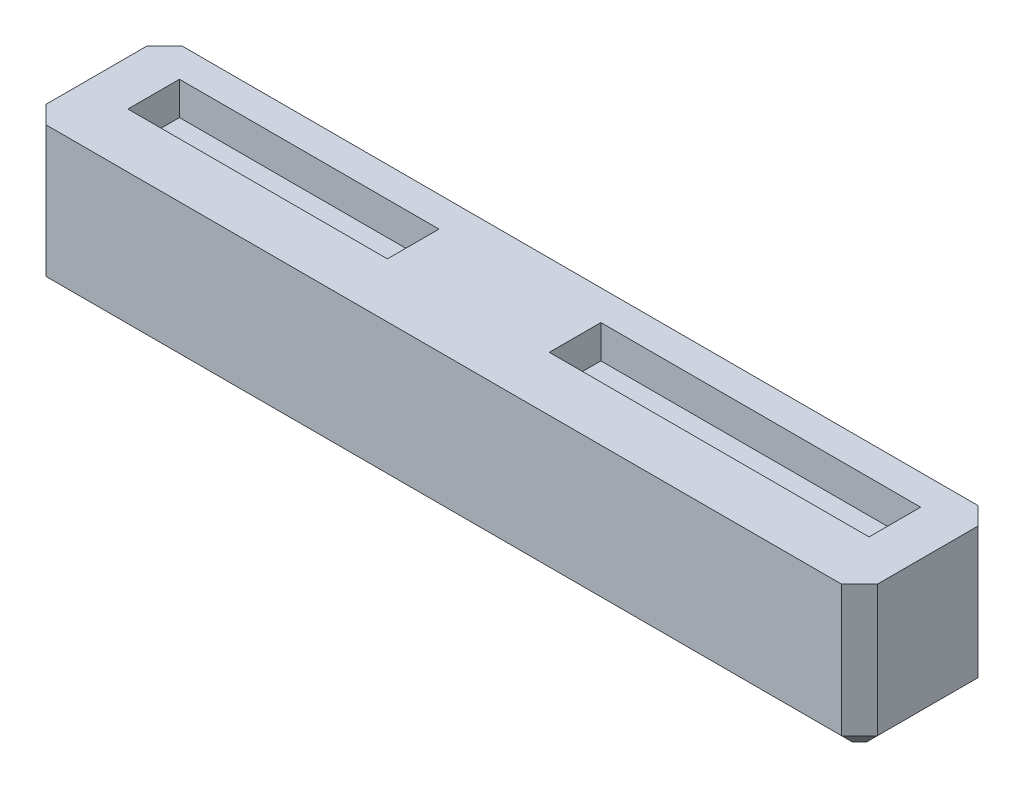
ISO-10303-21;
HEADER;
FILE_DESCRIPTION(('STEP AP214'),'2;1');
FILE_NAME('part.step','',(''),(''),'','','');
FILE_SCHEMA(('AUTOMOTIVE_DESIGN { 1 0 10303 214 1 1 1 1 }'));
ENDSEC;
DATA;
#1=APPLICATION_CONTEXT('core data for automotive mechanical design processes');
#2=APPLICATION_PROTOCOL_DEFINITION('international standard','automotive_design',2000,#1);
#3=PRODUCT_CONTEXT('',#1,'mechanical');
#4=PRODUCT('Part','Part','',(#3));
#5=PRODUCT_RELATED_PRODUCT_CATEGORY('part','',(#4));
#6=PRODUCT_DEFINITION_FORMATION('','',#4);
#7=PRODUCT_DEFINITION_CONTEXT('part definition',#1,'design');
#8=PRODUCT_DEFINITION('design','',#6,#7);
#9=PRODUCT_DEFINITION_SHAPE('','',#8);
#10=(LENGTH_UNIT() NAMED_UNIT(*) SI_UNIT(.MILLI.,.METRE.));
#11=(NAMED_UNIT(*) PLANE_ANGLE_UNIT() SI_UNIT($,.RADIAN.));
#12=(NAMED_UNIT(*) SI_UNIT($,.STERADIAN.) SOLID_ANGLE_UNIT());
#13=UNCERTAINTY_MEASURE_WITH_UNIT(LENGTH_MEASURE(1.E-05),#10,'distance_accuracy_value','');
#14=(GEOMETRIC_REPRESENTATION_CONTEXT(3) GLOBAL_UNCERTAINTY_ASSIGNED_CONTEXT((#13)) GLOBAL_UNIT_ASSIGNED_CONTEXT((#10,
#11,#12)) REPRESENTATION_CONTEXT('',''));
#15=CARTESIAN_POINT('',(0.,0.,0.));
#16=DIRECTION('',(0.,0.,1.));
#17=DIRECTION('',(1.,0.,0.));
#18=AXIS2_PLACEMENT_3D('',#15,#16,#17);
#19=CARTESIAN_POINT('',(142.669,-225.777307234154,-0.1));
#20=DIRECTION('',(-1.,0.,0.));
#21=DIRECTION('',(0.,0.,1.));
#22=AXIS2_PLACEMENT_3D('',#19,#20,#21);
#23=PLANE('',#22);
#24=DIRECTION('',(0.,1.,0.));
#25=VECTOR('',#24,1.);
#26=CARTESIAN_POINT('',(142.669,-225.777307234154,3.89));
#27=LINE('',#26,#25);
#28=CARTESIAN_POINT('',(142.669,-146.0008,3.89));
#29=VERTEX_POINT('',#28);
#30=CARTESIAN_POINT('',(142.669,-134.7208,3.89));
#31=VERTEX_POINT('',#30);
#32=EDGE_CURVE('E217',#29,#31,#27,.T.);
#33=ORIENTED_EDGE('',*,*,#32,.T.);
#34=DIRECTION('',(0.,0.,1.));
#35=VECTOR('',#34,1.);
#36=CARTESIAN_POINT('',(142.669,-134.7208,-0.1));
#37=LINE('',#36,#35);
#38=CARTESIAN_POINT('',(142.669,-134.7208,-0.459999999999995));
#39=VERTEX_POINT('',#38);
#40=EDGE_CURVE('E213',#39,#31,#37,.T.);
#41=ORIENTED_EDGE('',*,*,#40,.F.);
#42=DIRECTION('',(0.,1.,0.));
#43=VECTOR('',#42,1.);
#44=CARTESIAN_POINT('',(142.669,-164.554305137144,-0.459999999999995));
#45=LINE('',#44,#43);
#46=CARTESIAN_POINT('',(142.669,-137.5208,-0.459999999999995));
#47=VERTEX_POINT('',#46);
#48=EDGE_CURVE('E215',#47,#39,#45,.T.);
#49=ORIENTED_EDGE('',*,*,#48,.F.);
#50=DIRECTION('',(0.,0.,1.));
#51=VECTOR('',#50,1.);
#52=CARTESIAN_POINT('',(142.669,-137.5208,1.24));
#53=LINE('',#52,#51);
#54=CARTESIAN_POINT('',(142.669,-137.5208,1.24000000000001));
#55=VERTEX_POINT('',#54);
#56=EDGE_CURVE('E244',#47,#55,#53,.T.);
#57=ORIENTED_EDGE('',*,*,#56,.T.);
#58=DIRECTION('',(0.,-1.,0.));
#59=VECTOR('',#58,1.);
#60=CARTESIAN_POINT('',(142.669,-110.307543994846,1.24));
#61=LINE('',#60,#59);
#62=CARTESIAN_POINT('',(142.669,-146.0008,1.24));
#63=VERTEX_POINT('',#62);
#64=EDGE_CURVE('E266',#55,#63,#61,.T.);
#65=ORIENTED_EDGE('',*,*,#64,.T.);
#66=DIRECTION('',(0.,0.,-1.));
#67=VECTOR('',#66,1.);
#68=CARTESIAN_POINT('',(142.669,-146.0008,-0.1));
#69=LINE('',#68,#67);
#70=EDGE_CURVE('E381',#29,#63,#69,.T.);
#71=ORIENTED_EDGE('',*,*,#70,.F.);
#72=EDGE_LOOP('',(#33,#41,#49,#57,#65,#71));
#73=FACE_BOUND('',#72,.T.);
#74=ADVANCED_FACE('F45',(#73),#23,.T.);
#75=CARTESIAN_POINT('',(120.769,-225.777307234154,-0.100000000000003));
#76=DIRECTION('',(1.,0.,0.));
#77=DIRECTION('',(0.,0.,-1.));
#78=AXIS2_PLACEMENT_3D('',#75,#76,#77);
#79=PLANE('',#78);
#80=DIRECTION('',(0.,-1.,0.));
#81=VECTOR('',#80,1.);
#82=CARTESIAN_POINT('',(120.769,-110.307543994846,1.24000000000001));
#83=LINE('',#82,#81);
#84=CARTESIAN_POINT('',(120.769,-137.5208,1.24000000000001));
#85=VERTEX_POINT('',#84);
#86=CARTESIAN_POINT('',(120.769,-146.0008,1.24000000000001));
#87=VERTEX_POINT('',#86);
#88=EDGE_CURVE('E261',#85,#87,#83,.T.);
#89=ORIENTED_EDGE('',*,*,#88,.F.);
#90=DIRECTION('',(0.,0.,-1.));
#91=VECTOR('',#90,1.);
#92=CARTESIAN_POINT('',(120.769,-137.5208,1.24000000000001));
#93=LINE('',#92,#91);
#94=CARTESIAN_POINT('',(120.769,-137.5208,-0.459999999999995));
#95=VERTEX_POINT('',#94);
#96=EDGE_CURVE('E262',#85,#95,#93,.T.);
#97=ORIENTED_EDGE('',*,*,#96,.T.);
#98=DIRECTION('',(0.,1.,0.));
#99=VECTOR('',#98,1.);
#100=CARTESIAN_POINT('',(120.769,-164.554305137144,-0.459999999999995));
#101=LINE('',#100,#99);
#102=CARTESIAN_POINT('',(120.769,-134.7208,-0.459999999999995));
#103=VERTEX_POINT('',#102);
#104=EDGE_CURVE('E242',#95,#103,#101,.T.);
#105=ORIENTED_EDGE('',*,*,#104,.T.);
#106=DIRECTION('',(0.,0.,-1.));
#107=VECTOR('',#106,1.);
#108=CARTESIAN_POINT('',(120.769,-134.7208,-0.100000000000003));
#109=LINE('',#108,#107);
#110=CARTESIAN_POINT('',(120.769,-134.7208,3.89));
#111=VERTEX_POINT('',#110);
#112=EDGE_CURVE('E64',#111,#103,#109,.T.);
#113=ORIENTED_EDGE('',*,*,#112,.F.);
#114=DIRECTION('',(0.,1.,0.));
#115=VECTOR('',#114,1.);
#116=CARTESIAN_POINT('',(120.769,-225.777307234154,3.89));
#117=LINE('',#116,#115);
#118=CARTESIAN_POINT('',(120.769,-146.0008,3.89));
#119=VERTEX_POINT('',#118);
#120=EDGE_CURVE('E378',#119,#111,#117,.T.);
#121=ORIENTED_EDGE('',*,*,#120,.F.);
#122=DIRECTION('',(0.,0.,1.));
#123=VECTOR('',#122,1.);
#124=CARTESIAN_POINT('',(120.769,-146.0008,-0.100000000000003));
#125=LINE('',#124,#123);
#126=EDGE_CURVE('E396',#87,#119,#125,.T.);
#127=ORIENTED_EDGE('',*,*,#126,.F.);
#128=EDGE_LOOP('',(#89,#97,#105,#113,#121,#127));
#129=FACE_BOUND('',#128,.T.);
#130=ADVANCED_FACE('F549',(#129),#79,.T.);
#131=CARTESIAN_POINT('',(0.,-146.0008,0.));
#132=DIRECTION('',(0.,-1.,0.));
#133=DIRECTION('',(0.,0.,-1.));
#134=AXIS2_PLACEMENT_3D('',#131,#132,#133);
#135=PLANE('',#134);
#136=DIRECTION('',(1.,0.,0.));
#137=VECTOR('',#136,1.);
#138=CARTESIAN_POINT('',(142.669,-146.0008,1.24));
#139=LINE('',#138,#137);
#140=EDGE_CURVE('E270',#87,#63,#139,.T.);
#141=ORIENTED_EDGE('',*,*,#140,.F.);
#142=ORIENTED_EDGE('',*,*,#126,.T.);
#143=DIRECTION('',(1.,0.,0.));
#144=VECTOR('',#143,1.);
#145=CARTESIAN_POINT('',(142.669,-146.0008,3.89));
#146=LINE('',#145,#144);
#147=EDGE_CURVE('E386',#119,#29,#146,.T.);
#148=ORIENTED_EDGE('',*,*,#147,.T.);
#149=ORIENTED_EDGE('',*,*,#70,.T.);
#150=EDGE_LOOP('',(#141,#142,#148,#149));
#151=FACE_BOUND('',#150,.T.);
#152=ADVANCED_FACE('F554',(#151),#135,.F.);
#153=CARTESIAN_POINT('',(183.309,-225.777307234154,-0.099999999999995));
#154=DIRECTION('',(-1.,0.,0.));
#155=DIRECTION('',(0.,0.,1.));
#156=AXIS2_PLACEMENT_3D('',#153,#154,#155);
#157=PLANE('',#156);
#158=DIRECTION('',(0.,1.,0.));
#159=VECTOR('',#158,1.);
#160=CARTESIAN_POINT('',(183.309,-225.777307234154,3.89));
#161=LINE('',#160,#159);
#162=CARTESIAN_POINT('',(183.309,-146.0008,3.89));
#163=VERTEX_POINT('',#162);
#164=CARTESIAN_POINT('',(183.309,-134.7208,3.89));
#165=VERTEX_POINT('',#164);
#166=EDGE_CURVE('E305',#163,#165,#161,.T.);
#167=ORIENTED_EDGE('',*,*,#166,.T.);
#168=DIRECTION('',(0.,0.,1.));
#169=VECTOR('',#168,1.);
#170=CARTESIAN_POINT('',(183.309,-134.7208,-0.099999999999995));
#171=LINE('',#170,#169);
#172=CARTESIAN_POINT('',(183.309,-134.7208,-0.459999999999998));
#173=VERTEX_POINT('',#172);
#174=EDGE_CURVE('E347',#173,#165,#171,.T.);
#175=ORIENTED_EDGE('',*,*,#174,.F.);
#176=DIRECTION('',(0.,1.,0.));
#177=VECTOR('',#176,1.);
#178=CARTESIAN_POINT('',(183.309,-164.554305137144,-0.459999999999998));
#179=LINE('',#178,#177);
#180=CARTESIAN_POINT('',(183.309,-137.5208,-0.459999999999998));
#181=VERTEX_POINT('',#180);
#182=EDGE_CURVE('E237',#181,#173,#179,.T.);
#183=ORIENTED_EDGE('',*,*,#182,.F.);
#184=DIRECTION('',(0.,0.,1.));
#185=VECTOR('',#184,1.);
#186=CARTESIAN_POINT('',(183.309,-137.5208,1.24));
#187=LINE('',#186,#185);
#188=CARTESIAN_POINT('',(183.309,-137.5208,1.24));
#189=VERTEX_POINT('',#188);
#190=EDGE_CURVE('E282',#181,#189,#187,.T.);
#191=ORIENTED_EDGE('',*,*,#190,.T.);
#192=DIRECTION('',(0.,-1.,0.));
#193=VECTOR('',#192,1.);
#194=CARTESIAN_POINT('',(183.309,-110.307543994846,1.24));
#195=LINE('',#194,#193);
#196=CARTESIAN_POINT('',(183.309,-146.0008,1.24));
#197=VERTEX_POINT('',#196);
#198=EDGE_CURVE('E290',#189,#197,#195,.T.);
#199=ORIENTED_EDGE('',*,*,#198,.T.);
#200=DIRECTION('',(0.,0.,-1.));
#201=VECTOR('',#200,1.);
#202=CARTESIAN_POINT('',(183.309,-146.0008,-0.099999999999995));
#203=LINE('',#202,#201);
#204=EDGE_CURVE('E382',#163,#197,#203,.T.);
#205=ORIENTED_EDGE('',*,*,#204,.F.);
#206=EDGE_LOOP('',(#167,#175,#183,#191,#199,#205));
#207=FACE_BOUND('',#206,.T.);
#208=ADVANCED_FACE('F615',(#207),#157,.T.);
#209=CARTESIAN_POINT('',(156.329,-225.777307234154,-0.0999999999999983));
#210=DIRECTION('',(1.,0.,0.));
#211=DIRECTION('',(0.,0.,-1.));
#212=AXIS2_PLACEMENT_3D('',#209,#210,#211);
#213=PLANE('',#212);
#214=DIRECTION('',(0.,-1.,0.));
#215=VECTOR('',#214,1.);
#216=CARTESIAN_POINT('',(156.329,-110.307543994846,1.24));
#217=LINE('',#216,#215);
#218=CARTESIAN_POINT('',(156.329,-137.5208,1.24));
#219=VERTEX_POINT('',#218);
#220=CARTESIAN_POINT('',(156.329,-146.0008,1.24));
#221=VERTEX_POINT('',#220);
#222=EDGE_CURVE('E294',#219,#221,#217,.T.);
#223=ORIENTED_EDGE('',*,*,#222,.F.);
#224=DIRECTION('',(0.,0.,-1.));
#225=VECTOR('',#224,1.);
#226=CARTESIAN_POINT('',(156.329,-137.5208,1.24));
#227=LINE('',#226,#225);
#228=CARTESIAN_POINT('',(156.329,-137.5208,-0.459999999999998));
#229=VERTEX_POINT('',#228);
#230=EDGE_CURVE('E279',#219,#229,#227,.T.);
#231=ORIENTED_EDGE('',*,*,#230,.T.);
#232=DIRECTION('',(0.,1.,0.));
#233=VECTOR('',#232,1.);
#234=CARTESIAN_POINT('',(156.329,-164.554305137144,-0.459999999999998));
#235=LINE('',#234,#233);
#236=CARTESIAN_POINT('',(156.329,-134.7208,-0.459999999999998));
#237=VERTEX_POINT('',#236);
#238=EDGE_CURVE('E250',#229,#237,#235,.T.);
#239=ORIENTED_EDGE('',*,*,#238,.T.);
#240=DIRECTION('',(0.,0.,-1.));
#241=VECTOR('',#240,1.);
#242=CARTESIAN_POINT('',(156.329,-134.7208,-0.0999999999999983));
#243=LINE('',#242,#241);
#244=CARTESIAN_POINT('',(156.329,-134.7208,3.89));
#245=VERTEX_POINT('',#244);
#246=EDGE_CURVE('E72',#245,#237,#243,.T.);
#247=ORIENTED_EDGE('',*,*,#246,.F.);
#248=DIRECTION('',(0.,1.,0.));
#249=VECTOR('',#248,1.);
#250=CARTESIAN_POINT('',(156.329,-225.777307234154,3.89));
#251=LINE('',#250,#249);
#252=CARTESIAN_POINT('',(156.329,-146.0008,3.89));
#253=VERTEX_POINT('',#252);
#254=EDGE_CURVE('E373',#253,#245,#251,.T.);
#255=ORIENTED_EDGE('',*,*,#254,.F.);
#256=DIRECTION('',(0.,0.,1.));
#257=VECTOR('',#256,1.);
#258=CARTESIAN_POINT('',(156.329,-146.0008,-0.0999999999999983));
#259=LINE('',#258,#257);
#260=EDGE_CURVE('E385',#221,#253,#259,.T.);
#261=ORIENTED_EDGE('',*,*,#260,.F.);
#262=EDGE_LOOP('',(#223,#231,#239,#247,#255,#261));
#263=FACE_BOUND('',#262,.T.);
#264=ADVANCED_FACE('F620',(#263),#213,.T.);
#265=DIRECTION('',(1.,0.,0.));
#266=VECTOR('',#265,1.);
#267=CARTESIAN_POINT('',(183.309,-146.0008,1.24));
#268=LINE('',#267,#266);
#269=EDGE_CURVE('E274',#221,#197,#268,.T.);
#270=ORIENTED_EDGE('',*,*,#269,.F.);
#271=ORIENTED_EDGE('',*,*,#260,.T.);
#272=DIRECTION('',(1.,0.,0.));
#273=VECTOR('',#272,1.);
#274=CARTESIAN_POINT('',(183.309,-146.0008,3.89));
#275=LINE('',#274,#273);
#276=EDGE_CURVE('E387',#253,#163,#275,.T.);
#277=ORIENTED_EDGE('',*,*,#276,.T.);
#278=ORIENTED_EDGE('',*,*,#204,.T.);
#279=EDGE_LOOP('',(#270,#271,#277,#278));
#280=FACE_BOUND('',#279,.T.);
#281=ADVANCED_FACE('F617',(#280),#135,.F.);
#282=CARTESIAN_POINT('',(0.,-134.7208,0.));
#283=DIRECTION('',(0.,-1.,0.));
#284=DIRECTION('',(0.,0.,-1.));
#285=AXIS2_PLACEMENT_3D('',#282,#283,#284);
#286=PLANE('',#285);
#287=DIRECTION('',(-1.,0.,0.));
#288=VECTOR('',#287,1.);
#289=CARTESIAN_POINT('',(156.329,-134.7208,-0.459999999999998));
#290=LINE('',#289,#288);
#291=EDGE_CURVE('E234',#173,#237,#290,.T.);
#292=ORIENTED_EDGE('',*,*,#291,.F.);
#293=ORIENTED_EDGE('',*,*,#174,.T.);
#294=DIRECTION('',(-1.,0.,0.));
#295=VECTOR('',#294,1.);
#296=CARTESIAN_POINT('',(183.309,-134.7208,3.89));
#297=LINE('',#296,#295);
#298=EDGE_CURVE('E344',#165,#245,#297,.T.);
#299=ORIENTED_EDGE('',*,*,#298,.T.);
#300=ORIENTED_EDGE('',*,*,#246,.T.);
#301=EDGE_LOOP('',(#292,#293,#299,#300));
#302=FACE_BOUND('',#301,.T.);
#303=DIRECTION('',(0.707106781186547,0.,0.707106781186547));
#304=VECTOR('',#303,1.);
#305=CARTESIAN_POINT('',(185.609,-134.7208,-3.));
#306=LINE('',#305,#304);
#307=CARTESIAN_POINT('',(185.609,-134.7208,-3.));
#308=VERTEX_POINT('',#307);
#309=CARTESIAN_POINT('',(187.109,-134.7208,-1.5));
#310=VERTEX_POINT('',#309);
#311=EDGE_CURVE('E337',#308,#310,#306,.T.);
#312=ORIENTED_EDGE('',*,*,#311,.F.);
#313=DIRECTION('',(1.,0.,0.));
#314=VECTOR('',#313,1.);
#315=CARTESIAN_POINT('',(118.468997999667,-134.7208,-3.));
#316=LINE('',#315,#314);
#317=CARTESIAN_POINT('',(118.468997999667,-134.7208,-3.));
#318=VERTEX_POINT('',#317);
#319=EDGE_CURVE('E301',#318,#308,#316,.T.);
#320=ORIENTED_EDGE('',*,*,#319,.F.);
#321=DIRECTION('',(0.707106781186547,0.,-0.707106781186547));
#322=VECTOR('',#321,1.);
#323=CARTESIAN_POINT('',(116.968997999667,-134.7208,-1.5));
#324=LINE('',#323,#322);
#325=CARTESIAN_POINT('',(116.968997999667,-134.7208,-1.5));
#326=VERTEX_POINT('',#325);
#327=EDGE_CURVE('E307',#326,#318,#324,.T.);
#328=ORIENTED_EDGE('',*,*,#327,.F.);
#329=DIRECTION('',(0.,0.,-1.));
#330=VECTOR('',#329,1.);
#331=CARTESIAN_POINT('',(116.968997999667,-134.7208,-1.5));
#332=LINE('',#331,#330);
#333=CARTESIAN_POINT('',(116.968997999667,-134.7208,6.99999999999999));
#334=VERTEX_POINT('',#333);
#335=EDGE_CURVE('E312',#334,#326,#332,.T.);
#336=ORIENTED_EDGE('',*,*,#335,.F.);
#337=DIRECTION('',(-0.707106781186552,0.,-0.707106781186543));
#338=VECTOR('',#337,1.);
#339=CARTESIAN_POINT('',(118.468997999667,-134.7208,8.5));
#340=LINE('',#339,#338);
#341=CARTESIAN_POINT('',(118.468997999667,-134.7208,8.5));
#342=VERTEX_POINT('',#341);
#343=EDGE_CURVE('E317',#342,#334,#340,.T.);
#344=ORIENTED_EDGE('',*,*,#343,.F.);
#345=DIRECTION('',(-1.,0.,0.));
#346=VECTOR('',#345,1.);
#347=CARTESIAN_POINT('',(118.468997999667,-134.7208,8.5));
#348=LINE('',#347,#346);
#349=CARTESIAN_POINT('',(185.609,-134.7208,8.5));
#350=VERTEX_POINT('',#349);
#351=EDGE_CURVE('E322',#350,#342,#348,.T.);
#352=ORIENTED_EDGE('',*,*,#351,.F.);
#353=DIRECTION('',(-0.707106781186552,0.,0.707106781186543));
#354=VECTOR('',#353,1.);
#355=CARTESIAN_POINT('',(187.109,-134.7208,6.99999999999999));
#356=LINE('',#355,#354);
#357=CARTESIAN_POINT('',(187.109,-134.7208,6.99999999999999));
#358=VERTEX_POINT('',#357);
#359=EDGE_CURVE('E327',#358,#350,#356,.T.);
#360=ORIENTED_EDGE('',*,*,#359,.F.);
#361=DIRECTION('',(0.,0.,1.));
#362=VECTOR('',#361,1.);
#363=CARTESIAN_POINT('',(187.109,-134.7208,6.99999999999999));
#364=LINE('',#363,#362);
#365=EDGE_CURVE('E332',#310,#358,#364,.T.);
#366=ORIENTED_EDGE('',*,*,#365,.F.);
#367=EDGE_LOOP('',(#312,#320,#328,#336,#344,#352,#360,#366));
#368=FACE_BOUND('',#367,.T.);
#369=DIRECTION('',(-1.,0.,0.));
#370=VECTOR('',#369,1.);
#371=CARTESIAN_POINT('',(120.769,-134.7208,-0.459999999999995));
#372=LINE('',#371,#370);
#373=EDGE_CURVE('E226',#39,#103,#372,.T.);
#374=ORIENTED_EDGE('',*,*,#373,.F.);
#375=ORIENTED_EDGE('',*,*,#40,.T.);
#376=DIRECTION('',(-1.,0.,0.));
#377=VECTOR('',#376,1.);
#378=CARTESIAN_POINT('',(142.669,-134.7208,3.89));
#379=LINE('',#378,#377);
#380=EDGE_CURVE('E220',#31,#111,#379,.T.);
#381=ORIENTED_EDGE('',*,*,#380,.T.);
#382=ORIENTED_EDGE('',*,*,#112,.T.);
#383=EDGE_LOOP('',(#374,#375,#381,#382));
#384=FACE_BOUND('',#383,.T.);
#385=ADVANCED_FACE('F232',(#302,#368,#384),#286,.F.);
#386=CARTESIAN_POINT('',(185.609,-225.777307234154,-3.));
#387=DIRECTION('',(-0.707106781186548,0.,0.707106781186548));
#388=DIRECTION('',(0.707106781186548,0.,0.707106781186548));
#389=AXIS2_PLACEMENT_3D('',#386,#387,#388);
#390=PLANE('',#389);
#391=DIRECTION('',(0.,1.,0.));
#392=VECTOR('',#391,1.);
#393=CARTESIAN_POINT('',(187.109,-225.777307234154,-1.5));
#394=LINE('',#393,#392);
#395=CARTESIAN_POINT('',(187.109,-145.8008,-1.5));
#396=VERTEX_POINT('',#395);
#397=EDGE_CURVE('E336',#396,#310,#394,.T.);
#398=ORIENTED_EDGE('',*,*,#397,.F.);
#399=DIRECTION('',(-0.707106781186548,0.,-0.707106781186548));
#400=VECTOR('',#399,1.);
#401=CARTESIAN_POINT('',(185.609,-145.8008,-3.));
#402=LINE('',#401,#400);
#403=CARTESIAN_POINT('',(185.609,-145.8008,-3.));
#404=VERTEX_POINT('',#403);
#405=EDGE_CURVE('E433',#396,#404,#402,.T.);
#406=ORIENTED_EDGE('',*,*,#405,.T.);
#407=DIRECTION('',(0.,1.,0.));
#408=VECTOR('',#407,1.);
#409=CARTESIAN_POINT('',(185.609,-225.777307234154,-3.));
#410=LINE('',#409,#408);
#411=EDGE_CURVE('E341',#404,#308,#410,.T.);
#412=ORIENTED_EDGE('',*,*,#411,.T.);
#413=ORIENTED_EDGE('',*,*,#311,.T.);
#414=EDGE_LOOP('',(#398,#406,#412,#413));
#415=FACE_BOUND('',#414,.T.);
#416=ADVANCED_FACE('F504',(#415),#390,.F.);
#417=CARTESIAN_POINT('',(187.109,-225.777307234154,6.99999999999999));
#418=DIRECTION('',(-1.,0.,0.));
#419=DIRECTION('',(0.,0.,1.));
#420=AXIS2_PLACEMENT_3D('',#417,#418,#419);
#421=PLANE('',#420);
#422=DIRECTION('',(0.,1.,0.));
#423=VECTOR('',#422,1.);
#424=CARTESIAN_POINT('',(187.109,-225.777307234154,6.99999999999999));
#425=LINE('',#424,#423);
#426=CARTESIAN_POINT('',(187.109,-145.8008,6.99999999999999));
#427=VERTEX_POINT('',#426);
#428=EDGE_CURVE('E331',#427,#358,#425,.T.);
#429=ORIENTED_EDGE('',*,*,#428,.F.);
#430=DIRECTION('',(0.,0.,-1.));
#431=VECTOR('',#430,1.);
#432=CARTESIAN_POINT('',(187.109,-145.8008,-1.5));
#433=LINE('',#432,#431);
#434=EDGE_CURVE('E430',#427,#396,#433,.T.);
#435=ORIENTED_EDGE('',*,*,#434,.T.);
#436=ORIENTED_EDGE('',*,*,#397,.T.);
#437=ORIENTED_EDGE('',*,*,#365,.T.);
#438=EDGE_LOOP('',(#429,#435,#436,#437));
#439=FACE_BOUND('',#438,.T.);
#440=ADVANCED_FACE('F539',(#439),#421,.F.);
#441=CARTESIAN_POINT('',(187.109,-225.777307234154,6.99999999999999));
#442=DIRECTION('',(-0.707106781186543,0.,-0.707106781186552));
#443=DIRECTION('',(-0.707106781186552,0.,0.707106781186543));
#444=AXIS2_PLACEMENT_3D('',#441,#442,#443);
#445=PLANE('',#444);
#446=DIRECTION('',(0.,1.,0.));
#447=VECTOR('',#446,1.);
#448=CARTESIAN_POINT('',(185.609,-225.777307234154,8.5));
#449=LINE('',#448,#447);
#450=CARTESIAN_POINT('',(185.609,-145.8008,8.5));
#451=VERTEX_POINT('',#450);
#452=EDGE_CURVE('E326',#451,#350,#449,.T.);
#453=ORIENTED_EDGE('',*,*,#452,.F.);
#454=DIRECTION('',(0.707106781186552,0.,-0.707106781186543));
#455=VECTOR('',#454,1.);
#456=CARTESIAN_POINT('',(187.109,-145.8008,6.99999999999999));
#457=LINE('',#456,#455);
#458=EDGE_CURVE('E426',#451,#427,#457,.T.);
#459=ORIENTED_EDGE('',*,*,#458,.T.);
#460=ORIENTED_EDGE('',*,*,#428,.T.);
#461=ORIENTED_EDGE('',*,*,#359,.T.);
#462=EDGE_LOOP('',(#453,#459,#460,#461));
#463=FACE_BOUND('',#462,.T.);
#464=ADVANCED_FACE('F535',(#463),#445,.F.);
#465=CARTESIAN_POINT('',(118.468997999667,-225.777307234154,8.5));
#466=DIRECTION('',(0.,0.,-1.));
#467=DIRECTION('',(-1.,0.,0.));
#468=AXIS2_PLACEMENT_3D('',#465,#466,#467);
#469=PLANE('',#468);
#470=DIRECTION('',(0.,1.,0.));
#471=VECTOR('',#470,1.);
#472=CARTESIAN_POINT('',(118.468997999667,-225.777307234154,8.5));
#473=LINE('',#472,#471);
#474=CARTESIAN_POINT('',(118.468997999667,-145.8008,8.5));
#475=VERTEX_POINT('',#474);
#476=EDGE_CURVE('E321',#475,#342,#473,.T.);
#477=ORIENTED_EDGE('',*,*,#476,.F.);
#478=DIRECTION('',(1.,0.,0.));
#479=VECTOR('',#478,1.);
#480=CARTESIAN_POINT('',(185.609,-145.8008,8.5));
#481=LINE('',#480,#479);
#482=EDGE_CURVE('E11',#475,#451,#481,.T.);
#483=ORIENTED_EDGE('',*,*,#482,.T.);
#484=ORIENTED_EDGE('',*,*,#452,.T.);
#485=ORIENTED_EDGE('',*,*,#351,.T.);
#486=EDGE_LOOP('',(#477,#483,#484,#485));
#487=FACE_BOUND('',#486,.T.);
#488=ADVANCED_FACE('F530',(#487),#469,.F.);
#489=CARTESIAN_POINT('',(118.468997999667,-225.777307234154,8.5));
#490=DIRECTION('',(0.707106781186543,0.,-0.707106781186552));
#491=DIRECTION('',(-0.707106781186552,0.,-0.707106781186543));
#492=AXIS2_PLACEMENT_3D('',#489,#490,#491);
#493=PLANE('',#492);
#494=DIRECTION('',(0.,1.,0.));
#495=VECTOR('',#494,1.);
#496=CARTESIAN_POINT('',(116.968997999667,-225.777307234154,6.99999999999999));
#497=LINE('',#496,#495);
#498=CARTESIAN_POINT('',(116.968997999667,-145.8008,6.99999999999999));
#499=VERTEX_POINT('',#498);
#500=EDGE_CURVE('E316',#499,#334,#497,.T.);
#501=ORIENTED_EDGE('',*,*,#500,.F.);
#502=DIRECTION('',(0.707106781186552,0.,0.707106781186543));
#503=VECTOR('',#502,1.);
#504=CARTESIAN_POINT('',(118.468997999667,-145.8008,8.5));
#505=LINE('',#504,#503);
#506=EDGE_CURVE('E56',#499,#475,#505,.T.);
#507=ORIENTED_EDGE('',*,*,#506,.T.);
#508=ORIENTED_EDGE('',*,*,#476,.T.);
#509=ORIENTED_EDGE('',*,*,#343,.T.);
#510=EDGE_LOOP('',(#501,#507,#508,#509));
#511=FACE_BOUND('',#510,.T.);
#512=ADVANCED_FACE('F528',(#511),#493,.F.);
#513=CARTESIAN_POINT('',(116.968997999667,-225.777307234154,-1.5));
#514=DIRECTION('',(1.,0.,0.));
#515=DIRECTION('',(0.,0.,-1.));
#516=AXIS2_PLACEMENT_3D('',#513,#514,#515);
#517=PLANE('',#516);
#518=DIRECTION('',(0.,1.,0.));
#519=VECTOR('',#518,1.);
#520=CARTESIAN_POINT('',(116.968997999667,-225.777307234154,-1.5));
#521=LINE('',#520,#519);
#522=CARTESIAN_POINT('',(116.968997999667,-145.8008,-1.5));
#523=VERTEX_POINT('',#522);
#524=EDGE_CURVE('E311',#523,#326,#521,.T.);
#525=ORIENTED_EDGE('',*,*,#524,.F.);
#526=DIRECTION('',(0.,0.,1.));
#527=VECTOR('',#526,1.);
#528=CARTESIAN_POINT('',(116.968997999667,-145.8008,6.99999999999999));
#529=LINE('',#528,#527);
#530=EDGE_CURVE('E442',#523,#499,#529,.T.);
#531=ORIENTED_EDGE('',*,*,#530,.T.);
#532=ORIENTED_EDGE('',*,*,#500,.T.);
#533=ORIENTED_EDGE('',*,*,#335,.T.);
#534=EDGE_LOOP('',(#525,#531,#532,#533));
#535=FACE_BOUND('',#534,.T.);
#536=ADVANCED_FACE('F490',(#535),#517,.F.);
#537=CARTESIAN_POINT('',(116.968997999667,-225.777307234154,-1.5));
#538=DIRECTION('',(0.707106781186548,0.,0.707106781186548));
#539=DIRECTION('',(0.707106781186548,0.,-0.707106781186548));
#540=AXIS2_PLACEMENT_3D('',#537,#538,#539);
#541=PLANE('',#540);
#542=DIRECTION('',(0.,1.,0.));
#543=VECTOR('',#542,1.);
#544=CARTESIAN_POINT('',(118.468997999667,-225.777307234154,-3.));
#545=LINE('',#544,#543);
#546=CARTESIAN_POINT('',(118.468997999667,-145.8008,-3.));
#547=VERTEX_POINT('',#546);
#548=EDGE_CURVE('E306',#547,#318,#545,.T.);
#549=ORIENTED_EDGE('',*,*,#548,.F.);
#550=DIRECTION('',(-0.707106781186548,0.,0.707106781186548));
#551=VECTOR('',#550,1.);
#552=CARTESIAN_POINT('',(116.968997999667,-145.8008,-1.5));
#553=LINE('',#552,#551);
#554=EDGE_CURVE('E439',#547,#523,#553,.T.);
#555=ORIENTED_EDGE('',*,*,#554,.T.);
#556=ORIENTED_EDGE('',*,*,#524,.T.);
#557=ORIENTED_EDGE('',*,*,#327,.T.);
#558=EDGE_LOOP('',(#549,#555,#556,#557));
#559=FACE_BOUND('',#558,.T.);
#560=ADVANCED_FACE('F488',(#559),#541,.F.);
#561=CARTESIAN_POINT('',(118.468997999667,-225.777307234154,-3.));
#562=DIRECTION('',(0.,0.,1.));
#563=DIRECTION('',(1.,0.,0.));
#564=AXIS2_PLACEMENT_3D('',#561,#562,#563);
#565=PLANE('',#564);
#566=ORIENTED_EDGE('',*,*,#411,.F.);
#567=DIRECTION('',(-1.,0.,0.));
#568=VECTOR('',#567,1.);
#569=CARTESIAN_POINT('',(118.468997999667,-145.8008,-3.));
#570=LINE('',#569,#568);
#571=EDGE_CURVE('E436',#404,#547,#570,.T.);
#572=ORIENTED_EDGE('',*,*,#571,.T.);
#573=ORIENTED_EDGE('',*,*,#548,.T.);
#574=ORIENTED_EDGE('',*,*,#319,.T.);
#575=EDGE_LOOP('',(#566,#572,#573,#574));
#576=FACE_BOUND('',#575,.T.);
#577=ADVANCED_FACE('F501',(#576),#565,.F.);
#578=CARTESIAN_POINT('',(183.309,-225.777307234154,3.89));
#579=DIRECTION('',(0.,0.,-1.));
#580=DIRECTION('',(-1.,0.,0.));
#581=AXIS2_PLACEMENT_3D('',#578,#579,#580);
#582=PLANE('',#581);
#583=ORIENTED_EDGE('',*,*,#276,.F.);
#584=ORIENTED_EDGE('',*,*,#254,.T.);
#585=ORIENTED_EDGE('',*,*,#298,.F.);
#586=ORIENTED_EDGE('',*,*,#166,.F.);
#587=EDGE_LOOP('',(#583,#584,#585,#586));
#588=FACE_BOUND('',#587,.T.);
#589=ADVANCED_FACE('F608',(#588),#582,.T.);
#590=CARTESIAN_POINT('',(142.669,-225.777307234154,3.89));
#591=DIRECTION('',(0.,0.,-1.));
#592=DIRECTION('',(-1.,0.,0.));
#593=AXIS2_PLACEMENT_3D('',#590,#591,#592);
#594=PLANE('',#593);
#595=ORIENTED_EDGE('',*,*,#147,.F.);
#596=ORIENTED_EDGE('',*,*,#120,.T.);
#597=ORIENTED_EDGE('',*,*,#380,.F.);
#598=ORIENTED_EDGE('',*,*,#32,.F.);
#599=EDGE_LOOP('',(#595,#596,#597,#598));
#600=FACE_BOUND('',#599,.T.);
#601=ADVANCED_FACE('F559',(#600),#594,.T.);
#602=CARTESIAN_POINT('',(0.,-147.3008,0.));
#603=DIRECTION('',(0.,-1.,0.));
#604=DIRECTION('',(0.,0.,-1.));
#605=AXIS2_PLACEMENT_3D('',#602,#603,#604);
#606=PLANE('',#605);
#607=DIRECTION('',(0.,0.,1.));
#608=VECTOR('',#607,1.);
#609=CARTESIAN_POINT('',(185.609,-147.3008,6.99999999999999));
#610=LINE('',#609,#608);
#611=CARTESIAN_POINT('',(185.609,-147.3008,-0.878679656440294));
#612=VERTEX_POINT('',#611);
#613=CARTESIAN_POINT('',(185.609,-147.3008,6.3786796564404));
#614=VERTEX_POINT('',#613);
#615=EDGE_CURVE('E419',#612,#614,#610,.T.);
#616=ORIENTED_EDGE('',*,*,#615,.T.);
#617=DIRECTION('',(-0.707106781186552,0.,0.707106781186543));
#618=VECTOR('',#617,1.);
#619=CARTESIAN_POINT('',(184.54833982822,-147.3008,7.43933982822019));
#620=LINE('',#619,#618);
#621=CARTESIAN_POINT('',(184.98767965644,-147.3008,7.));
#622=VERTEX_POINT('',#621);
#623=EDGE_CURVE('E422',#614,#622,#620,.T.);
#624=ORIENTED_EDGE('',*,*,#623,.T.);
#625=DIRECTION('',(-1.,0.,0.));
#626=VECTOR('',#625,1.);
#627=CARTESIAN_POINT('',(118.468997999667,-147.3008,7.));
#628=LINE('',#627,#626);
#629=CARTESIAN_POINT('',(119.090318343227,-147.3008,7.));
#630=VERTEX_POINT('',#629);
#631=EDGE_CURVE('E391',#622,#630,#628,.T.);
#632=ORIENTED_EDGE('',*,*,#631,.T.);
#633=DIRECTION('',(-0.707106781186552,0.,-0.707106781186543));
#634=VECTOR('',#633,1.);
#635=CARTESIAN_POINT('',(118.029658171447,-147.3008,5.93933982822017));
#636=LINE('',#635,#634);
#637=CARTESIAN_POINT('',(118.468997999667,-147.3008,6.37867965644035));
#638=VERTEX_POINT('',#637);
#639=EDGE_CURVE('E404',#630,#638,#636,.T.);
#640=ORIENTED_EDGE('',*,*,#639,.T.);
#641=DIRECTION('',(0.,0.,-1.));
#642=VECTOR('',#641,1.);
#643=CARTESIAN_POINT('',(118.468997999667,-147.3008,-1.5));
#644=LINE('',#643,#642);
#645=CARTESIAN_POINT('',(118.468997999667,-147.3008,-0.878679656440367));
#646=VERTEX_POINT('',#645);
#647=EDGE_CURVE('E407',#638,#646,#644,.T.);
#648=ORIENTED_EDGE('',*,*,#647,.T.);
#649=DIRECTION('',(0.707106781186548,0.,-0.707106781186548));
#650=VECTOR('',#649,1.);
#651=CARTESIAN_POINT('',(119.529658171447,-147.3008,-1.93933982822018));
#652=LINE('',#651,#650);
#653=CARTESIAN_POINT('',(119.090318343227,-147.3008,-1.5));
#654=VERTEX_POINT('',#653);
#655=EDGE_CURVE('E410',#646,#654,#652,.T.);
#656=ORIENTED_EDGE('',*,*,#655,.T.);
#657=DIRECTION('',(1.,0.,0.));
#658=VECTOR('',#657,1.);
#659=CARTESIAN_POINT('',(185.609,-147.3008,-1.5));
#660=LINE('',#659,#658);
#661=CARTESIAN_POINT('',(184.98767965644,-147.3008,-1.5));
#662=VERTEX_POINT('',#661);
#663=EDGE_CURVE('E413',#654,#662,#660,.T.);
#664=ORIENTED_EDGE('',*,*,#663,.T.);
#665=DIRECTION('',(0.707106781186548,0.,0.707106781186548));
#666=VECTOR('',#665,1.);
#667=CARTESIAN_POINT('',(186.04833982822,-147.3008,-0.439339828220151));
#668=LINE('',#667,#666);
#669=EDGE_CURVE('E416',#662,#612,#668,.T.);
#670=ORIENTED_EDGE('',*,*,#669,.T.);
#671=EDGE_LOOP('',(#616,#624,#632,#640,#648,#656,#664,#670));
#672=FACE_BOUND('',#671,.T.);
#673=ADVANCED_FACE('F517',(#672),#606,.T.);
#674=CARTESIAN_POINT('',(58.7951591716133,-147.3008,58.7951591716133));
#675=DIRECTION('',(-0.500000000000001,-0.707106781186546,-0.500000000000001));
#676=DIRECTION('',(-0.707106781186548,0.,0.707106781186548));
#677=AXIS2_PLACEMENT_3D('',#674,#675,#676);
#678=PLANE('',#677);
#679=DIRECTION('',(0.678598344545848,-0.678598344545848,0.281084637714816));
#680=VECTOR('',#679,1.);
#681=CARTESIAN_POINT('',(118.636600494074,-147.468402494407,-0.809256430169463));
#682=LINE('',#681,#680);
#683=EDGE_CURVE('E467',#523,#646,#682,.T.);
#684=ORIENTED_EDGE('',*,*,#683,.F.);
#685=ORIENTED_EDGE('',*,*,#554,.F.);
#686=DIRECTION('',(0.281084637714816,-0.678598344545848,0.678598344545848));
#687=VECTOR('',#686,1.);
#688=CARTESIAN_POINT('',(125.827397728443,-163.565548422573,14.7647484225732));
#689=LINE('',#688,#687);
#690=EDGE_CURVE('E50',#654,#547,#689,.F.);
#691=ORIENTED_EDGE('',*,*,#690,.F.);
#692=ORIENTED_EDGE('',*,*,#655,.F.);
#693=EDGE_LOOP('',(#684,#685,#691,#692));
#694=FACE_BOUND('',#693,.T.);
#695=ADVANCED_FACE('F48',(#694),#678,.T.);
#696=CARTESIAN_POINT('',(0.,-147.3008,-1.5));
#697=DIRECTION('',(0.,-0.707106781186547,-0.707106781186547));
#698=DIRECTION('',(-1.,0.,0.));
#699=AXIS2_PLACEMENT_3D('',#696,#697,#698);
#700=PLANE('',#699);
#701=ORIENTED_EDGE('',*,*,#690,.T.);
#702=ORIENTED_EDGE('',*,*,#571,.F.);
#703=DIRECTION('',(-0.281084637714837,-0.678598344545844,0.678598344545844));
#704=VECTOR('',#703,1.);
#705=CARTESIAN_POINT('',(170.372066960744,-182.586010392341,33.7852103923408));
#706=LINE('',#705,#704);
#707=EDGE_CURVE('E464',#662,#404,#706,.F.);
#708=ORIENTED_EDGE('',*,*,#707,.F.);
#709=ORIENTED_EDGE('',*,*,#663,.F.);
#710=EDGE_LOOP('',(#701,#702,#708,#709));
#711=FACE_BOUND('',#710,.T.);
#712=ADVANCED_FACE('F480',(#711),#700,.T.);
#713=CARTESIAN_POINT('',(118.468997999667,-147.3008,0.));
#714=DIRECTION('',(-0.707106781186547,-0.707106781186547,0.));
#715=DIRECTION('',(0.,0.,1.));
#716=AXIS2_PLACEMENT_3D('',#713,#714,#715);
#717=PLANE('',#716);
#718=ORIENTED_EDGE('',*,*,#683,.T.);
#719=ORIENTED_EDGE('',*,*,#647,.F.);
#720=DIRECTION('',(0.678598344545848,-0.678598344545848,-0.281084637714815));
#721=VECTOR('',#720,1.);
#722=CARTESIAN_POINT('',(101.630033677178,-130.461835677511,13.3536070551317));
#723=LINE('',#722,#721);
#724=EDGE_CURVE('E460',#499,#638,#723,.T.);
#725=ORIENTED_EDGE('',*,*,#724,.F.);
#726=ORIENTED_EDGE('',*,*,#530,.F.);
#727=EDGE_LOOP('',(#718,#719,#725,#726));
#728=FACE_BOUND('',#727,.T.);
#729=ADVANCED_FACE('F520',(#728),#717,.T.);
#730=CARTESIAN_POINT('',(93.2438398282202,-147.3008,-93.2438398282202));
#731=DIRECTION('',(0.499999999999995,-0.707106781186554,-0.499999999999995));
#732=DIRECTION('',(-0.707106781186548,0.,-0.707106781186548));
#733=AXIS2_PLACEMENT_3D('',#730,#731,#732);
#734=PLANE('',#733);
#735=ORIENTED_EDGE('',*,*,#707,.T.);
#736=ORIENTED_EDGE('',*,*,#405,.F.);
#737=DIRECTION('',(-0.678598344545844,-0.678598344545844,0.281084637714837));
#738=VECTOR('',#737,1.);
#739=CARTESIAN_POINT('',(160.69330006912,-172.21649993088,9.44174117094924));
#740=LINE('',#739,#738);
#741=EDGE_CURVE('E456',#612,#396,#740,.F.);
#742=ORIENTED_EDGE('',*,*,#741,.F.);
#743=ORIENTED_EDGE('',*,*,#669,.F.);
#744=EDGE_LOOP('',(#735,#736,#742,#743));
#745=FACE_BOUND('',#744,.T.);
#746=ADVANCED_FACE('F508',(#745),#734,.T.);
#747=CARTESIAN_POINT('',(56.0451591716126,-147.3008,-56.0451591716133));
#748=DIRECTION('',(-0.499999999999999,-0.707106781186544,0.500000000000006));
#749=DIRECTION('',(0.707106781186552,0.,0.707106781186543));
#750=AXIS2_PLACEMENT_3D('',#747,#748,#749);
#751=PLANE('',#750);
#752=ORIENTED_EDGE('',*,*,#724,.T.);
#753=ORIENTED_EDGE('',*,*,#639,.F.);
#754=DIRECTION('',(0.28108463771481,-0.678598344545849,-0.678598344545849));
#755=VECTOR('',#754,1.);
#756=CARTESIAN_POINT('',(109.681162166209,-124.585087546958,29.7157124530424));
#757=LINE('',#756,#755);
#758=EDGE_CURVE('E452',#475,#630,#757,.T.);
#759=ORIENTED_EDGE('',*,*,#758,.F.);
#760=ORIENTED_EDGE('',*,*,#506,.F.);
#761=EDGE_LOOP('',(#752,#753,#759,#760));
#762=FACE_BOUND('',#761,.T.);
#763=ADVANCED_FACE('F523',(#762),#751,.T.);
#764=CARTESIAN_POINT('',(185.609,-147.3008,0.));
#765=DIRECTION('',(0.707106781186547,-0.707106781186547,0.));
#766=DIRECTION('',(0.,0.,-1.));
#767=AXIS2_PLACEMENT_3D('',#764,#765,#766);
#768=PLANE('',#767);
#769=ORIENTED_EDGE('',*,*,#741,.T.);
#770=ORIENTED_EDGE('',*,*,#434,.F.);
#771=DIRECTION('',(-0.678598344545852,-0.678598344545852,-0.281084637714798));
#772=VECTOR('',#771,1.);
#773=CARTESIAN_POINT('',(184.392307871525,-148.517492128475,5.87470927559357));
#774=LINE('',#773,#772);
#775=EDGE_CURVE('E449',#614,#427,#774,.F.);
#776=ORIENTED_EDGE('',*,*,#775,.F.);
#777=ORIENTED_EDGE('',*,*,#615,.F.);
#778=EDGE_LOOP('',(#769,#770,#776,#777));
#779=FACE_BOUND('',#778,.T.);
#780=ADVANCED_FACE('F513',(#779),#768,.T.);
#781=CARTESIAN_POINT('',(0.,-147.3008,7.));
#782=DIRECTION('',(0.,-0.707106781186547,0.707106781186547));
#783=DIRECTION('',(1.,0.,0.));
#784=AXIS2_PLACEMENT_3D('',#781,#782,#783);
#785=PLANE('',#784);
#786=ORIENTED_EDGE('',*,*,#758,.T.);
#787=ORIENTED_EDGE('',*,*,#631,.F.);
#788=DIRECTION('',(0.281084637714793,0.678598344545853,0.678598344545853));
#789=VECTOR('',#788,1.);
#790=CARTESIAN_POINT('',(170.372066960748,-182.586010392336,-28.2852103923359));
#791=LINE('',#790,#789);
#792=EDGE_CURVE('E286',#451,#622,#791,.F.);
#793=ORIENTED_EDGE('',*,*,#792,.F.);
#794=ORIENTED_EDGE('',*,*,#482,.F.);
#795=EDGE_LOOP('',(#786,#787,#793,#794));
#796=FACE_BOUND('',#795,.T.);
#797=ADVANCED_FACE('F568',(#796),#785,.T.);
#798=CARTESIAN_POINT('',(95.993839828219,-147.3008,95.9938398282203));
#799=DIRECTION('',(0.500000000000004,-0.707106781186538,0.50000000000001));
#800=DIRECTION('',(0.707106781186552,0.,-0.707106781186543));
#801=AXIS2_PLACEMENT_3D('',#798,#799,#800);
#802=PLANE('',#801);
#803=ORIENTED_EDGE('',*,*,#775,.T.);
#804=ORIENTED_EDGE('',*,*,#458,.F.);
#805=ORIENTED_EDGE('',*,*,#792,.T.);
#806=ORIENTED_EDGE('',*,*,#623,.F.);
#807=EDGE_LOOP('',(#803,#804,#805,#806));
#808=FACE_BOUND('',#807,.T.);
#809=ADVANCED_FACE('F561',(#808),#802,.T.);
#810=CARTESIAN_POINT('',(183.309,-110.307543994846,1.24));
#811=DIRECTION('',(0.,0.,-1.));
#812=DIRECTION('',(-1.,0.,0.));
#813=AXIS2_PLACEMENT_3D('',#810,#811,#812);
#814=PLANE('',#813);
#815=ORIENTED_EDGE('',*,*,#198,.F.);
#816=DIRECTION('',(-1.,0.,0.));
#817=VECTOR('',#816,1.);
#818=CARTESIAN_POINT('',(183.309,-137.5208,1.24));
#819=LINE('',#818,#817);
#820=EDGE_CURVE('E283',#189,#219,#819,.T.);
#821=ORIENTED_EDGE('',*,*,#820,.T.);
#822=ORIENTED_EDGE('',*,*,#222,.T.);
#823=ORIENTED_EDGE('',*,*,#269,.T.);
#824=EDGE_LOOP('',(#815,#821,#822,#823));
#825=FACE_BOUND('',#824,.T.);
#826=ADVANCED_FACE('F567',(#825),#814,.F.);
#827=CARTESIAN_POINT('',(182.209,-137.5208,0.));
#828=DIRECTION('',(0.,-1.,0.));
#829=DIRECTION('',(0.,0.,-1.));
#830=AXIS2_PLACEMENT_3D('',#827,#828,#829);
#831=PLANE('',#830);
#832=ORIENTED_EDGE('',*,*,#190,.F.);
#833=DIRECTION('',(-1.,0.,0.));
#834=VECTOR('',#833,1.);
#835=CARTESIAN_POINT('',(156.329,-137.5208,-0.459999999999998));
#836=LINE('',#835,#834);
#837=EDGE_CURVE('E249',#181,#229,#836,.T.);
#838=ORIENTED_EDGE('',*,*,#837,.T.);
#839=ORIENTED_EDGE('',*,*,#230,.F.);
#840=ORIENTED_EDGE('',*,*,#820,.F.);
#841=EDGE_LOOP('',(#832,#838,#839,#840));
#842=FACE_BOUND('',#841,.T.);
#843=ADVANCED_FACE('F744',(#842),#831,.F.);
#844=CARTESIAN_POINT('',(142.669,-110.307543994846,1.24));
#845=DIRECTION('',(0.,0.,-1.));
#846=DIRECTION('',(-1.,0.,0.));
#847=AXIS2_PLACEMENT_3D('',#844,#845,#846);
#848=PLANE('',#847);
#849=ORIENTED_EDGE('',*,*,#64,.F.);
#850=DIRECTION('',(-1.,0.,0.));
#851=VECTOR('',#850,1.);
#852=CARTESIAN_POINT('',(142.669,-137.5208,1.24));
#853=LINE('',#852,#851);
#854=EDGE_CURVE('E257',#55,#85,#853,.T.);
#855=ORIENTED_EDGE('',*,*,#854,.T.);
#856=ORIENTED_EDGE('',*,*,#88,.T.);
#857=ORIENTED_EDGE('',*,*,#140,.T.);
#858=EDGE_LOOP('',(#849,#855,#856,#857));
#859=FACE_BOUND('',#858,.T.);
#860=ADVANCED_FACE('F757',(#859),#848,.F.);
#861=CARTESIAN_POINT('',(182.209,-137.5208,0.));
#862=DIRECTION('',(0.,-1.,0.));
#863=DIRECTION('',(0.,0.,-1.));
#864=AXIS2_PLACEMENT_3D('',#861,#862,#863);
#865=PLANE('',#864);
#866=ORIENTED_EDGE('',*,*,#56,.F.);
#867=DIRECTION('',(-1.,0.,0.));
#868=VECTOR('',#867,1.);
#869=CARTESIAN_POINT('',(120.769,-137.5208,-0.459999999999995));
#870=LINE('',#869,#868);
#871=EDGE_CURVE('E229',#47,#95,#870,.T.);
#872=ORIENTED_EDGE('',*,*,#871,.T.);
#873=ORIENTED_EDGE('',*,*,#96,.F.);
#874=ORIENTED_EDGE('',*,*,#854,.F.);
#875=EDGE_LOOP('',(#866,#872,#873,#874));
#876=FACE_BOUND('',#875,.T.);
#877=ADVANCED_FACE('F770',(#876),#865,.F.);
#878=CARTESIAN_POINT('',(156.329,-164.554305137144,-0.459999999999998));
#879=DIRECTION('',(0.,0.,-1.));
#880=DIRECTION('',(-1.,0.,0.));
#881=AXIS2_PLACEMENT_3D('',#878,#879,#880);
#882=PLANE('',#881);
#883=ORIENTED_EDGE('',*,*,#182,.T.);
#884=ORIENTED_EDGE('',*,*,#291,.T.);
#885=ORIENTED_EDGE('',*,*,#238,.F.);
#886=ORIENTED_EDGE('',*,*,#837,.F.);
#887=EDGE_LOOP('',(#883,#884,#885,#886));
#888=FACE_BOUND('',#887,.T.);
#889=ADVANCED_FACE('F780',(#888),#882,.F.);
#890=CARTESIAN_POINT('',(120.769,-164.554305137144,-0.459999999999995));
#891=DIRECTION('',(0.,0.,-1.));
#892=DIRECTION('',(-1.,0.,0.));
#893=AXIS2_PLACEMENT_3D('',#890,#891,#892);
#894=PLANE('',#893);
#895=ORIENTED_EDGE('',*,*,#48,.T.);
#896=ORIENTED_EDGE('',*,*,#373,.T.);
#897=ORIENTED_EDGE('',*,*,#104,.F.);
#898=ORIENTED_EDGE('',*,*,#871,.F.);
#899=EDGE_LOOP('',(#895,#896,#897,#898));
#900=FACE_BOUND('',#899,.T.);
#901=ADVANCED_FACE('F224',(#900),#894,.F.);
#902=CLOSED_SHELL('',(#74,#130,#152,#208,#264,#281,#385,#416,#440,#464,#488,#512,#536,#560,#577,
#589,#601,#673,#695,#712,#729,#746,#763,#780,#797,#809,#826,#843,#860,#877,#889,#901));
#903=MANIFOLD_SOLID_BREP('B2',#902);
#904=ADVANCED_BREP_SHAPE_REPRESENTATION('',(#18,#903),#14);
#905=SHAPE_DEFINITION_REPRESENTATION(#9,#904);
ENDSEC;
END-ISO-10303-21;
